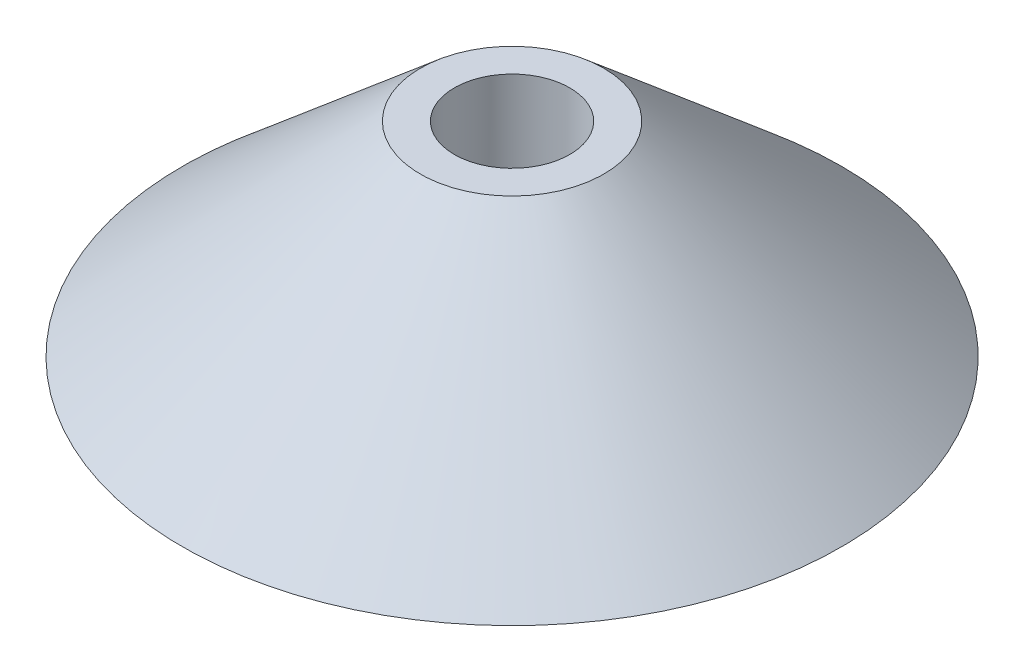
ISO-10303-21;
HEADER;
FILE_DESCRIPTION(('STEP AP214'),'2;1');
FILE_NAME('part.step','',(''),(''),'','','');
FILE_SCHEMA(('AUTOMOTIVE_DESIGN { 1 0 10303 214 1 1 1 1 }'));
ENDSEC;
DATA;
#1=APPLICATION_CONTEXT('core data for automotive mechanical design processes');
#2=APPLICATION_PROTOCOL_DEFINITION('international standard','automotive_design',2000,#1);
#3=PRODUCT_CONTEXT('',#1,'mechanical');
#4=PRODUCT('Part','Part','',(#3));
#5=PRODUCT_RELATED_PRODUCT_CATEGORY('part','',(#4));
#6=PRODUCT_DEFINITION_FORMATION('','',#4);
#7=PRODUCT_DEFINITION_CONTEXT('part definition',#1,'design');
#8=PRODUCT_DEFINITION('design','',#6,#7);
#9=PRODUCT_DEFINITION_SHAPE('','',#8);
#10=(LENGTH_UNIT() NAMED_UNIT(*) SI_UNIT(.MILLI.,.METRE.));
#11=(NAMED_UNIT(*) PLANE_ANGLE_UNIT() SI_UNIT($,.RADIAN.));
#12=(NAMED_UNIT(*) SI_UNIT($,.STERADIAN.) SOLID_ANGLE_UNIT());
#13=UNCERTAINTY_MEASURE_WITH_UNIT(LENGTH_MEASURE(1.E-05),#10,'distance_accuracy_value','');
#14=(GEOMETRIC_REPRESENTATION_CONTEXT(3) GLOBAL_UNCERTAINTY_ASSIGNED_CONTEXT((#13)) GLOBAL_UNIT_ASSIGNED_CONTEXT((#10,
#11,#12)) REPRESENTATION_CONTEXT('',''));
#15=CARTESIAN_POINT('',(0.,0.,0.));
#16=DIRECTION('',(0.,0.,1.));
#17=DIRECTION('',(1.,0.,0.));
#18=AXIS2_PLACEMENT_3D('',#15,#16,#17);
#19=CARTESIAN_POINT('',(0.,11.3265306122449,0.));
#20=DIRECTION('',(0.,1.,0.));
#21=DIRECTION('',(0.,0.,1.));
#22=AXIS2_PLACEMENT_3D('',#19,#20,#21);
#23=CYLINDRICAL_SURFACE('',#22,1.7);
#24=CARTESIAN_POINT('',(0.,6.,0.));
#25=DIRECTION('',(0.,1.,0.));
#26=DIRECTION('',(0.,0.,1.));
#27=AXIS2_PLACEMENT_3D('',#24,#25,#26);
#28=CIRCLE('',#27,1.7);
#29=CARTESIAN_POINT('',(0.,6.,1.7));
#30=VERTEX_POINT('',#29);
#31=EDGE_CURVE('E11',#30,#30,#28,.T.);
#32=ORIENTED_EDGE('',*,*,#31,.T.);
#33=EDGE_LOOP('',(#32));
#34=FACE_BOUND('',#33,.T.);
#35=CARTESIAN_POINT('',(0.,2.5,0.));
#36=DIRECTION('',(0.,-1.,0.));
#37=DIRECTION('',(0.,0.,-1.));
#38=AXIS2_PLACEMENT_3D('',#35,#36,#37);
#39=CIRCLE('',#38,1.7);
#40=CARTESIAN_POINT('',(0.,2.5,-1.7));
#41=VERTEX_POINT('',#40);
#42=EDGE_CURVE('E39',#41,#41,#39,.T.);
#43=ORIENTED_EDGE('',*,*,#42,.T.);
#44=EDGE_LOOP('',(#43));
#45=FACE_BOUND('',#44,.T.);
#46=ADVANCED_FACE('F35',(#34,#45),#23,.F.);
#47=CARTESIAN_POINT('',(-2.7,6.,0.));
#48=DIRECTION('',(0.,1.,0.));
#49=DIRECTION('',(0.,0.,1.));
#50=AXIS2_PLACEMENT_3D('',#47,#48,#49);
#51=PLANE('',#50);
#52=CARTESIAN_POINT('',(0.,6.,0.));
#53=DIRECTION('',(0.,1.,0.));
#54=DIRECTION('',(0.,0.,1.));
#55=AXIS2_PLACEMENT_3D('',#52,#53,#54);
#56=CIRCLE('',#55,2.7);
#57=CARTESIAN_POINT('',(0.,6.,-2.7));
#58=VERTEX_POINT('',#57);
#59=EDGE_CURVE('E143',#58,#58,#56,.T.);
#60=ORIENTED_EDGE('',*,*,#59,.T.);
#61=EDGE_LOOP('',(#60));
#62=FACE_BOUND('',#61,.T.);
#63=ORIENTED_EDGE('',*,*,#31,.F.);
#64=EDGE_LOOP('',(#63));
#65=FACE_BOUND('',#64,.T.);
#66=ADVANCED_FACE('F37',(#62,#65),#51,.T.);
#67=CARTESIAN_POINT('',(-9.7,0.,0.));
#68=DIRECTION('',(0.,-1.,0.));
#69=DIRECTION('',(0.,0.,-1.));
#70=AXIS2_PLACEMENT_3D('',#67,#68,#69);
#71=PLANE('',#70);
#72=DIRECTION('',(0.999934266270664,0.,-0.0114657375580363));
#73=VECTOR('',#72,1.);
#74=CARTESIAN_POINT('',(-1.766334166084,0.,-2.97994355881522));
#75=LINE('',#74,#73);
#76=CARTESIAN_POINT('',(-1.766334166084,0.,-2.97994355881522));
#77=VERTEX_POINT('',#76);
#78=CARTESIAN_POINT('',(1.69753974073579,0.,-3.01966203880876));
#79=VERTEX_POINT('',#78);
#80=EDGE_CURVE('E51',#77,#79,#75,.T.);
#81=ORIENTED_EDGE('',*,*,#80,.F.);
#82=DIRECTION('',(0.490037513136947,0.,-0.871701345483966));
#83=VECTOR('',#82,1.);
#84=CARTESIAN_POINT('',(-3.46387390681979,0.,0.0397184799935381));
#85=LINE('',#84,#83);
#86=CARTESIAN_POINT('',(-3.46387390681979,0.,0.0397184799935381));
#87=VERTEX_POINT('',#86);
#88=EDGE_CURVE('E134',#87,#77,#85,.T.);
#89=ORIENTED_EDGE('',*,*,#88,.F.);
#90=DIRECTION('',(-0.509896753133716,0.,-0.86023560792593));
#91=VECTOR('',#90,1.);
#92=CARTESIAN_POINT('',(-1.69753974073579,0.,3.01966203880876));
#93=LINE('',#92,#91);
#94=CARTESIAN_POINT('',(-1.69753974073579,0.,3.01966203880876));
#95=VERTEX_POINT('',#94);
#96=EDGE_CURVE('E132',#95,#87,#93,.T.);
#97=ORIENTED_EDGE('',*,*,#96,.F.);
#98=DIRECTION('',(-0.999934266270664,0.,0.0114657375580359));
#99=VECTOR('',#98,1.);
#100=CARTESIAN_POINT('',(1.766334166084,0.,2.97994355881522));
#101=LINE('',#100,#99);
#102=CARTESIAN_POINT('',(1.766334166084,0.,2.97994355881522));
#103=VERTEX_POINT('',#102);
#104=EDGE_CURVE('E99',#103,#95,#101,.T.);
#105=ORIENTED_EDGE('',*,*,#104,.F.);
#106=DIRECTION('',(-0.490037513136948,0.,0.871701345483965));
#107=VECTOR('',#106,1.);
#108=CARTESIAN_POINT('',(3.46387390681979,0.,-0.0397184799935382));
#109=LINE('',#108,#107);
#110=CARTESIAN_POINT('',(3.46387390681979,0.,-0.0397184799935382));
#111=VERTEX_POINT('',#110);
#112=EDGE_CURVE('E128',#111,#103,#109,.T.);
#113=ORIENTED_EDGE('',*,*,#112,.F.);
#114=DIRECTION('',(0.509896753133716,0.,0.86023560792593));
#115=VECTOR('',#114,1.);
#116=CARTESIAN_POINT('',(1.69753974073579,0.,-3.01966203880876));
#117=LINE('',#116,#115);
#118=EDGE_CURVE('E125',#79,#111,#117,.T.);
#119=ORIENTED_EDGE('',*,*,#118,.F.);
#120=EDGE_LOOP('',(#81,#89,#97,#105,#113,#119));
#121=FACE_BOUND('',#120,.T.);
#122=CARTESIAN_POINT('',(0.,0.,0.));
#123=DIRECTION('',(0.,1.,0.));
#124=DIRECTION('',(0.,0.,1.));
#125=AXIS2_PLACEMENT_3D('',#122,#123,#124);
#126=CIRCLE('',#125,9.7);
#127=CARTESIAN_POINT('',(0.,0.,-9.7));
#128=VERTEX_POINT('',#127);
#129=EDGE_CURVE('E44',#128,#128,#126,.T.);
#130=ORIENTED_EDGE('',*,*,#129,.F.);
#131=EDGE_LOOP('',(#130));
#132=FACE_BOUND('',#131,.T.);
#133=ADVANCED_FACE('F152',(#121,#132),#71,.T.);
#134=CARTESIAN_POINT('',(0.,6.,0.));
#135=DIRECTION('',(0.,-1.,0.));
#136=DIRECTION('',(0.,0.,-1.));
#137=AXIS2_PLACEMENT_3D('',#134,#135,#136);
#138=CONICAL_SURFACE('',#137,2.7,0.862170054667226);
#139=CARTESIAN_POINT('',(0.,0.,-9.7));
#140=CARTESIAN_POINT('',(0.,0.0625000000000002,-9.62708333333333));
#141=CARTESIAN_POINT('',(0.,0.125,-9.55416666666667));
#142=CARTESIAN_POINT('',(0.,0.25,-9.40833333333333));
#143=CARTESIAN_POINT('',(0.,0.3125,-9.33541666666667));
#144=CARTESIAN_POINT('',(0.,0.4375,-9.18958333333333));
#145=CARTESIAN_POINT('',(0.,0.5,-9.11666666666667));
#146=CARTESIAN_POINT('',(0.,0.625,-8.97083333333333));
#147=CARTESIAN_POINT('',(0.,0.6875,-8.89791666666667));
#148=CARTESIAN_POINT('',(0.,0.8125,-8.75208333333333));
#149=CARTESIAN_POINT('',(0.,0.875,-8.67916666666667));
#150=CARTESIAN_POINT('',(0.,1.,-8.53333333333333));
#151=CARTESIAN_POINT('',(0.,1.0625,-8.46041666666667));
#152=CARTESIAN_POINT('',(0.,1.1875,-8.31458333333333));
#153=CARTESIAN_POINT('',(0.,1.25,-8.24166666666667));
#154=CARTESIAN_POINT('',(0.,1.375,-8.09583333333333));
#155=CARTESIAN_POINT('',(0.,1.4375,-8.02291666666667));
#156=CARTESIAN_POINT('',(0.,1.5625,-7.87708333333333));
#157=CARTESIAN_POINT('',(0.,1.625,-7.80416666666667));
#158=CARTESIAN_POINT('',(0.,1.75,-7.65833333333333));
#159=CARTESIAN_POINT('',(0.,1.8125,-7.58541666666667));
#160=CARTESIAN_POINT('',(0.,1.9375,-7.43958333333333));
#161=CARTESIAN_POINT('',(0.,2.,-7.36666666666667));
#162=CARTESIAN_POINT('',(0.,2.125,-7.22083333333333));
#163=CARTESIAN_POINT('',(0.,2.1875,-7.14791666666667));
#164=CARTESIAN_POINT('',(0.,2.3125,-7.00208333333333));
#165=CARTESIAN_POINT('',(0.,2.375,-6.92916666666667));
#166=CARTESIAN_POINT('',(0.,2.5,-6.78333333333333));
#167=CARTESIAN_POINT('',(0.,2.5625,-6.71041666666667));
#168=CARTESIAN_POINT('',(0.,2.6875,-6.56458333333333));
#169=CARTESIAN_POINT('',(0.,2.75,-6.49166666666667));
#170=CARTESIAN_POINT('',(0.,2.875,-6.34583333333333));
#171=CARTESIAN_POINT('',(0.,2.9375,-6.27291666666667));
#172=CARTESIAN_POINT('',(0.,3.0625,-6.12708333333333));
#173=CARTESIAN_POINT('',(0.,3.125,-6.05416666666667));
#174=CARTESIAN_POINT('',(0.,3.25,-5.90833333333333));
#175=CARTESIAN_POINT('',(0.,3.3125,-5.83541666666667));
#176=CARTESIAN_POINT('',(0.,3.4375,-5.68958333333333));
#177=CARTESIAN_POINT('',(0.,3.5,-5.61666666666667));
#178=CARTESIAN_POINT('',(0.,3.625,-5.47083333333333));
#179=CARTESIAN_POINT('',(0.,3.6875,-5.39791666666667));
#180=CARTESIAN_POINT('',(0.,3.8125,-5.25208333333333));
#181=CARTESIAN_POINT('',(0.,3.875,-5.17916666666667));
#182=CARTESIAN_POINT('',(0.,4.,-5.03333333333333));
#183=CARTESIAN_POINT('',(0.,4.0625,-4.96041666666667));
#184=CARTESIAN_POINT('',(0.,4.1875,-4.81458333333333));
#185=CARTESIAN_POINT('',(0.,4.25,-4.74166666666667));
#186=CARTESIAN_POINT('',(0.,4.375,-4.59583333333333));
#187=CARTESIAN_POINT('',(0.,4.4375,-4.52291666666667));
#188=CARTESIAN_POINT('',(0.,4.5625,-4.37708333333333));
#189=CARTESIAN_POINT('',(0.,4.625,-4.30416666666667));
#190=CARTESIAN_POINT('',(0.,4.75,-4.15833333333333));
#191=CARTESIAN_POINT('',(0.,4.8125,-4.08541666666667));
#192=CARTESIAN_POINT('',(0.,4.9375,-3.93958333333333));
#193=CARTESIAN_POINT('',(0.,5.,-3.86666666666667));
#194=CARTESIAN_POINT('',(0.,5.125,-3.72083333333333));
#195=CARTESIAN_POINT('',(0.,5.1875,-3.64791666666667));
#196=CARTESIAN_POINT('',(0.,5.3125,-3.50208333333333));
#197=CARTESIAN_POINT('',(0.,5.375,-3.42916666666667));
#198=CARTESIAN_POINT('',(0.,5.5,-3.28333333333333));
#199=CARTESIAN_POINT('',(0.,5.5625,-3.21041666666667));
#200=CARTESIAN_POINT('',(0.,5.6875,-3.06458333333333));
#201=CARTESIAN_POINT('',(0.,5.75,-2.99166666666667));
#202=CARTESIAN_POINT('',(0.,5.875,-2.84583333333333));
#203=CARTESIAN_POINT('',(0.,5.9375,-2.77291666666667));
#204=CARTESIAN_POINT('',(0.,6.,-2.7));
#205=B_SPLINE_CURVE_WITH_KNOTS('',3,(#139,#140,#141,#142,#143,#144,#145,#146,#147,#148,#149,
#150,#151,#152,#153,#154,#155,#156,#157,#158,#159,#160,#161,#162,#163,#164,#165,#166,#167,#168,
#169,#170,#171,#172,#173,#174,#175,#176,#177,#178,#179,#180,#181,#182,#183,#184,#185,#186,#187,
#188,#189,#190,#191,#192,#193,#194,#195,#196,#197,#198,#199,#200,#201,#202,#203,#204),
.UNSPECIFIED.,.F.,.F.,(4,2,2,2,2,2,2,2,2,2,2,2,2,2,2,2,2,2,2,2,2,2,2,2,2,2,2,2,2,2,2,2,4),(0.,
0.288110764290403,0.576221528580806,0.864332292871207,1.15244305716161,1.44055382145201,
1.72866458574242,2.01677535003282,2.30488611432322,2.59299687861362,2.88110764290403,
3.16921840719443,3.45732917148483,3.74543993577523,4.03355070006564,4.32166146435604,
4.60977222864644,4.89788299293685,5.18599375722725,5.47410452151765,5.76221528580805,
6.05032605009846,6.33843681438886,6.62654757867926,6.91465834296967,7.20276910726007,
7.49087987155047,7.77899063584087,8.06710140013127,8.35521216442168,8.64332292871208,
8.93143369300248,9.21954445729289),.UNSPECIFIED.);
#206=EDGE_CURVE('BSEAM149',#128,#58,#205,.T.);
#207=ORIENTED_EDGE('',*,*,#129,.T.);
#208=ORIENTED_EDGE('',*,*,#59,.F.);
#209=ORIENTED_EDGE('',*,*,#206,.T.);
#210=ORIENTED_EDGE('',*,*,#206,.F.);
#211=EDGE_LOOP('',(#207,#209,#208,#210));
#212=FACE_BOUND('',#211,.T.);
#213=ADVANCED_FACE('F149',(#212),#138,.T.);
#214=CARTESIAN_POINT('',(-1.766334166084,2.5,-2.97994355881522));
#215=DIRECTION('',(-0.0114657375580363,0.,-0.999934266270664));
#216=DIRECTION('',(-0.999934266270664,0.,0.0114657375580363));
#217=AXIS2_PLACEMENT_3D('',#214,#215,#216);
#218=PLANE('',#217);
#219=ORIENTED_EDGE('',*,*,#80,.T.);
#220=DIRECTION('',(0.,-1.,0.));
#221=VECTOR('',#220,1.);
#222=CARTESIAN_POINT('',(1.69753974073579,2.5,-3.01966203880876));
#223=LINE('',#222,#221);
#224=CARTESIAN_POINT('',(1.69753974073579,2.5,-3.01966203880876));
#225=VERTEX_POINT('',#224);
#226=EDGE_CURVE('E81',#225,#79,#223,.T.);
#227=ORIENTED_EDGE('',*,*,#226,.F.);
#228=DIRECTION('',(0.999934266270664,0.,-0.0114657375580363));
#229=VECTOR('',#228,1.);
#230=CARTESIAN_POINT('',(-1.766334166084,2.5,-2.97994355881522));
#231=LINE('',#230,#229);
#232=CARTESIAN_POINT('',(-1.766334166084,2.5,-2.97994355881522));
#233=VERTEX_POINT('',#232);
#234=EDGE_CURVE('E136',#233,#225,#231,.T.);
#235=ORIENTED_EDGE('',*,*,#234,.F.);
#236=DIRECTION('',(0.,-1.,0.));
#237=VECTOR('',#236,1.);
#238=CARTESIAN_POINT('',(-1.766334166084,2.5,-2.97994355881522));
#239=LINE('',#238,#237);
#240=EDGE_CURVE('E59',#233,#77,#239,.T.);
#241=ORIENTED_EDGE('',*,*,#240,.T.);
#242=EDGE_LOOP('',(#219,#227,#235,#241));
#243=FACE_BOUND('',#242,.T.);
#244=ADVANCED_FACE('F160',(#243),#218,.F.);
#245=CARTESIAN_POINT('',(-3.46387390681979,2.5,0.0397184799935381));
#246=DIRECTION('',(-0.871701345483966,0.,-0.490037513136947));
#247=DIRECTION('',(-0.490037513136947,0.,0.871701345483966));
#248=AXIS2_PLACEMENT_3D('',#245,#246,#247);
#249=PLANE('',#248);
#250=ORIENTED_EDGE('',*,*,#88,.T.);
#251=ORIENTED_EDGE('',*,*,#240,.F.);
#252=DIRECTION('',(0.490037513136947,0.,-0.871701345483966));
#253=VECTOR('',#252,1.);
#254=CARTESIAN_POINT('',(-3.46387390681979,2.5,0.0397184799935381));
#255=LINE('',#254,#253);
#256=CARTESIAN_POINT('',(-3.46387390681979,2.5,0.0397184799935381));
#257=VERTEX_POINT('',#256);
#258=EDGE_CURVE('E111',#257,#233,#255,.T.);
#259=ORIENTED_EDGE('',*,*,#258,.F.);
#260=DIRECTION('',(0.,-1.,0.));
#261=VECTOR('',#260,1.);
#262=CARTESIAN_POINT('',(-3.46387390681979,2.5,0.0397184799935381));
#263=LINE('',#262,#261);
#264=EDGE_CURVE('E103',#257,#87,#263,.T.);
#265=ORIENTED_EDGE('',*,*,#264,.T.);
#266=EDGE_LOOP('',(#250,#251,#259,#265));
#267=FACE_BOUND('',#266,.T.);
#268=ADVANCED_FACE('F182',(#267),#249,.F.);
#269=CARTESIAN_POINT('',(-1.69753974073579,2.5,3.01966203880876));
#270=DIRECTION('',(-0.86023560792593,0.,0.509896753133716));
#271=DIRECTION('',(0.509896753133716,0.,0.86023560792593));
#272=AXIS2_PLACEMENT_3D('',#269,#270,#271);
#273=PLANE('',#272);
#274=ORIENTED_EDGE('',*,*,#96,.T.);
#275=ORIENTED_EDGE('',*,*,#264,.F.);
#276=DIRECTION('',(-0.509896753133716,0.,-0.86023560792593));
#277=VECTOR('',#276,1.);
#278=CARTESIAN_POINT('',(-1.69753974073579,2.5,3.01966203880876));
#279=LINE('',#278,#277);
#280=CARTESIAN_POINT('',(-1.69753974073579,2.5,3.01966203880876));
#281=VERTEX_POINT('',#280);
#282=EDGE_CURVE('E107',#281,#257,#279,.T.);
#283=ORIENTED_EDGE('',*,*,#282,.F.);
#284=DIRECTION('',(0.,-1.,0.));
#285=VECTOR('',#284,1.);
#286=CARTESIAN_POINT('',(-1.69753974073579,2.5,3.01966203880876));
#287=LINE('',#286,#285);
#288=EDGE_CURVE('E92',#281,#95,#287,.T.);
#289=ORIENTED_EDGE('',*,*,#288,.T.);
#290=EDGE_LOOP('',(#274,#275,#283,#289));
#291=FACE_BOUND('',#290,.T.);
#292=ADVANCED_FACE('F108',(#291),#273,.F.);
#293=CARTESIAN_POINT('',(1.766334166084,2.5,2.97994355881522));
#294=DIRECTION('',(0.0114657375580359,0.,0.999934266270664));
#295=DIRECTION('',(0.999934266270664,0.,-0.0114657375580359));
#296=AXIS2_PLACEMENT_3D('',#293,#294,#295);
#297=PLANE('',#296);
#298=ORIENTED_EDGE('',*,*,#104,.T.);
#299=ORIENTED_EDGE('',*,*,#288,.F.);
#300=DIRECTION('',(-0.999934266270664,0.,0.0114657375580359));
#301=VECTOR('',#300,1.);
#302=CARTESIAN_POINT('',(1.766334166084,2.5,2.97994355881522));
#303=LINE('',#302,#301);
#304=CARTESIAN_POINT('',(1.766334166084,2.5,2.97994355881522));
#305=VERTEX_POINT('',#304);
#306=EDGE_CURVE('E96',#305,#281,#303,.T.);
#307=ORIENTED_EDGE('',*,*,#306,.F.);
#308=DIRECTION('',(0.,-1.,0.));
#309=VECTOR('',#308,1.);
#310=CARTESIAN_POINT('',(1.766334166084,2.5,2.97994355881522));
#311=LINE('',#310,#309);
#312=EDGE_CURVE('E104',#305,#103,#311,.T.);
#313=ORIENTED_EDGE('',*,*,#312,.T.);
#314=EDGE_LOOP('',(#298,#299,#307,#313));
#315=FACE_BOUND('',#314,.T.);
#316=ADVANCED_FACE('F94',(#315),#297,.F.);
#317=CARTESIAN_POINT('',(3.46387390681979,2.5,-0.0397184799935382));
#318=DIRECTION('',(0.871701345483965,0.,0.490037513136948));
#319=DIRECTION('',(0.490037513136948,0.,-0.871701345483966));
#320=AXIS2_PLACEMENT_3D('',#317,#318,#319);
#321=PLANE('',#320);
#322=ORIENTED_EDGE('',*,*,#112,.T.);
#323=ORIENTED_EDGE('',*,*,#312,.F.);
#324=DIRECTION('',(-0.490037513136948,0.,0.871701345483965));
#325=VECTOR('',#324,1.);
#326=CARTESIAN_POINT('',(3.46387390681979,2.5,-0.0397184799935382));
#327=LINE('',#326,#325);
#328=CARTESIAN_POINT('',(3.46387390681979,2.5,-0.0397184799935382));
#329=VERTEX_POINT('',#328);
#330=EDGE_CURVE('E117',#329,#305,#327,.T.);
#331=ORIENTED_EDGE('',*,*,#330,.F.);
#332=DIRECTION('',(0.,-1.,0.));
#333=VECTOR('',#332,1.);
#334=CARTESIAN_POINT('',(3.46387390681979,2.5,-0.0397184799935382));
#335=LINE('',#334,#333);
#336=EDGE_CURVE('E140',#329,#111,#335,.T.);
#337=ORIENTED_EDGE('',*,*,#336,.T.);
#338=EDGE_LOOP('',(#322,#323,#331,#337));
#339=FACE_BOUND('',#338,.T.);
#340=ADVANCED_FACE('F178',(#339),#321,.F.);
#341=CARTESIAN_POINT('',(1.69753974073579,2.5,-3.01966203880876));
#342=DIRECTION('',(0.86023560792593,0.,-0.509896753133716));
#343=DIRECTION('',(-0.509896753133716,0.,-0.86023560792593));
#344=AXIS2_PLACEMENT_3D('',#341,#342,#343);
#345=PLANE('',#344);
#346=ORIENTED_EDGE('',*,*,#118,.T.);
#347=ORIENTED_EDGE('',*,*,#336,.F.);
#348=DIRECTION('',(0.509896753133716,0.,0.86023560792593));
#349=VECTOR('',#348,1.);
#350=CARTESIAN_POINT('',(1.69753974073579,2.5,-3.01966203880876));
#351=LINE('',#350,#349);
#352=EDGE_CURVE('E119',#225,#329,#351,.T.);
#353=ORIENTED_EDGE('',*,*,#352,.F.);
#354=ORIENTED_EDGE('',*,*,#226,.T.);
#355=EDGE_LOOP('',(#346,#347,#353,#354));
#356=FACE_BOUND('',#355,.T.);
#357=ADVANCED_FACE('F173',(#356),#345,.F.);
#358=CARTESIAN_POINT('',(0.,2.5,0.));
#359=DIRECTION('',(0.,-1.,0.));
#360=DIRECTION('',(0.,0.,-1.));
#361=AXIS2_PLACEMENT_3D('',#358,#359,#360);
#362=PLANE('',#361);
#363=ORIENTED_EDGE('',*,*,#42,.F.);
#364=EDGE_LOOP('',(#363));
#365=FACE_BOUND('',#364,.T.);
#366=ORIENTED_EDGE('',*,*,#234,.T.);
#367=ORIENTED_EDGE('',*,*,#352,.T.);
#368=ORIENTED_EDGE('',*,*,#330,.T.);
#369=ORIENTED_EDGE('',*,*,#306,.T.);
#370=ORIENTED_EDGE('',*,*,#282,.T.);
#371=ORIENTED_EDGE('',*,*,#258,.T.);
#372=EDGE_LOOP('',(#366,#367,#368,#369,#370,#371));
#373=FACE_BOUND('',#372,.T.);
#374=ADVANCED_FACE('F114',(#365,#373),#362,.T.);
#375=CLOSED_SHELL('',(#46,#66,#133,#213,#244,#268,#292,#316,#340,#357,#374));
#376=MANIFOLD_SOLID_BREP('B2',#375);
#377=ADVANCED_BREP_SHAPE_REPRESENTATION('',(#18,#376),#14);
#378=SHAPE_DEFINITION_REPRESENTATION(#9,#377);
ENDSEC;
END-ISO-10303-21;
